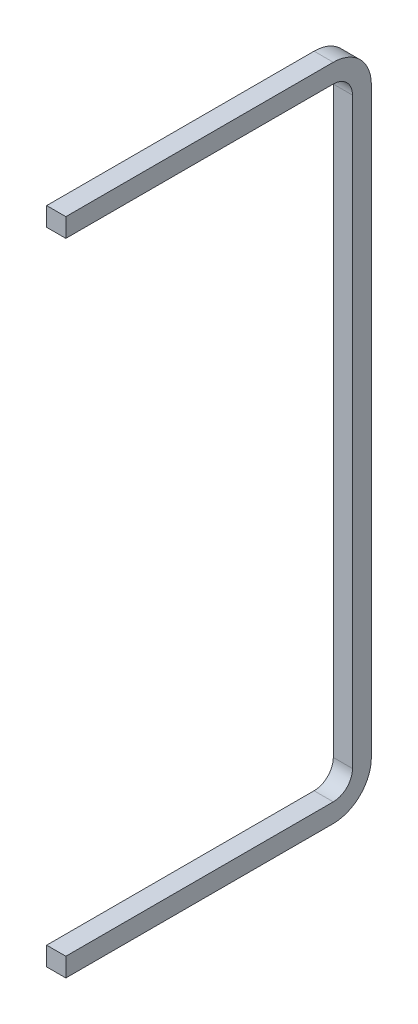
ISO-10303-21;
HEADER;
FILE_DESCRIPTION(('STEP AP214'),'2;1');
FILE_NAME('part.step','',(''),(''),'','','');
FILE_SCHEMA(('AUTOMOTIVE_DESIGN { 1 0 10303 214 1 1 1 1 }'));
ENDSEC;
DATA;
#1=APPLICATION_CONTEXT('core data for automotive mechanical design processes');
#2=APPLICATION_PROTOCOL_DEFINITION('international standard','automotive_design',2000,#1);
#3=PRODUCT_CONTEXT('',#1,'mechanical');
#4=PRODUCT('Part','Part','',(#3));
#5=PRODUCT_RELATED_PRODUCT_CATEGORY('part','',(#4));
#6=PRODUCT_DEFINITION_FORMATION('','',#4);
#7=PRODUCT_DEFINITION_CONTEXT('part definition',#1,'design');
#8=PRODUCT_DEFINITION('design','',#6,#7);
#9=PRODUCT_DEFINITION_SHAPE('','',#8);
#10=(LENGTH_UNIT() NAMED_UNIT(*) SI_UNIT(.MILLI.,.METRE.));
#11=(NAMED_UNIT(*) PLANE_ANGLE_UNIT() SI_UNIT($,.RADIAN.));
#12=(NAMED_UNIT(*) SI_UNIT($,.STERADIAN.) SOLID_ANGLE_UNIT());
#13=UNCERTAINTY_MEASURE_WITH_UNIT(LENGTH_MEASURE(1.E-05),#10,'distance_accuracy_value','');
#14=(GEOMETRIC_REPRESENTATION_CONTEXT(3) GLOBAL_UNCERTAINTY_ASSIGNED_CONTEXT((#13)) GLOBAL_UNIT_ASSIGNED_CONTEXT((#10,
#11,#12)) REPRESENTATION_CONTEXT('',''));
#15=CARTESIAN_POINT('',(0.,0.,0.));
#16=DIRECTION('',(0.,0.,1.));
#17=DIRECTION('',(1.,0.,0.));
#18=AXIS2_PLACEMENT_3D('',#15,#16,#17);
#19=CARTESIAN_POINT('',(17.,-1151.763,0.));
#20=DIRECTION('',(0.,1.,0.));
#21=DIRECTION('',(0.,0.,1.));
#22=AXIS2_PLACEMENT_3D('',#19,#20,#21);
#23=PLANE('',#22);
#24=DIRECTION('',(0.,0.,-1.));
#25=VECTOR('',#24,1.);
#26=CARTESIAN_POINT('',(-17.,-1151.763,0.));
#27=LINE('',#26,#25);
#28=CARTESIAN_POINT('',(-17.,-1151.763,0.));
#29=VERTEX_POINT('',#28);
#30=CARTESIAN_POINT('',(-17.,-1151.763,-473.9005));
#31=VERTEX_POINT('',#30);
#32=EDGE_CURVE('E141',#29,#31,#27,.T.);
#33=ORIENTED_EDGE('',*,*,#32,.T.);
#34=DIRECTION('',(-1.,0.,0.));
#35=VECTOR('',#34,1.);
#36=CARTESIAN_POINT('',(17.,-1151.763,-473.9005));
#37=LINE('',#36,#35);
#38=CARTESIAN_POINT('',(17.,-1151.763,-473.9005));
#39=VERTEX_POINT('',#38);
#40=EDGE_CURVE('E139',#39,#31,#37,.T.);
#41=ORIENTED_EDGE('',*,*,#40,.F.);
#42=DIRECTION('',(0.,0.,-1.));
#43=VECTOR('',#42,1.);
#44=CARTESIAN_POINT('',(17.,-1151.763,0.));
#45=LINE('',#44,#43);
#46=CARTESIAN_POINT('',(17.,-1151.763,0.));
#47=VERTEX_POINT('',#46);
#48=EDGE_CURVE('E129',#47,#39,#45,.T.);
#49=ORIENTED_EDGE('',*,*,#48,.F.);
#50=DIRECTION('',(-1.,0.,0.));
#51=VECTOR('',#50,1.);
#52=CARTESIAN_POINT('',(17.,-1151.763,0.));
#53=LINE('',#52,#51);
#54=EDGE_CURVE('E144',#47,#29,#53,.T.);
#55=ORIENTED_EDGE('',*,*,#54,.T.);
#56=EDGE_LOOP('',(#33,#41,#49,#55));
#57=FACE_BOUND('',#56,.T.);
#58=ADVANCED_FACE('F35',(#57),#23,.F.);
#59=CARTESIAN_POINT('',(17.,16.7005,-473.9005));
#60=DIRECTION('',(0.,-1.,0.));
#61=DIRECTION('',(0.,0.,-1.));
#62=AXIS2_PLACEMENT_3D('',#59,#60,#61);
#63=PLANE('',#62);
#64=DIRECTION('',(0.,0.,1.));
#65=VECTOR('',#64,1.);
#66=CARTESIAN_POINT('',(-17.,16.7005,-473.9005));
#67=LINE('',#66,#65);
#68=CARTESIAN_POINT('',(-17.,16.7005,-473.9005));
#69=VERTEX_POINT('',#68);
#70=CARTESIAN_POINT('',(-17.,16.7005,0.));
#71=VERTEX_POINT('',#70);
#72=EDGE_CURVE('E153',#69,#71,#67,.T.);
#73=ORIENTED_EDGE('',*,*,#72,.T.);
#74=DIRECTION('',(-1.,0.,0.));
#75=VECTOR('',#74,1.);
#76=CARTESIAN_POINT('',(17.,16.7005,0.));
#77=LINE('',#76,#75);
#78=CARTESIAN_POINT('',(17.,16.7005,0.));
#79=VERTEX_POINT('',#78);
#80=EDGE_CURVE('E44',#79,#71,#77,.T.);
#81=ORIENTED_EDGE('',*,*,#80,.F.);
#82=DIRECTION('',(0.,0.,1.));
#83=VECTOR('',#82,1.);
#84=CARTESIAN_POINT('',(17.,16.7005,-473.9005));
#85=LINE('',#84,#83);
#86=CARTESIAN_POINT('',(17.,16.7005,-473.9005));
#87=VERTEX_POINT('',#86);
#88=EDGE_CURVE('E223',#87,#79,#85,.T.);
#89=ORIENTED_EDGE('',*,*,#88,.F.);
#90=DIRECTION('',(-1.,0.,0.));
#91=VECTOR('',#90,1.);
#92=CARTESIAN_POINT('',(17.,16.7005,-473.9005));
#93=LINE('',#92,#91);
#94=EDGE_CURVE('E11',#87,#69,#93,.T.);
#95=ORIENTED_EDGE('',*,*,#94,.T.);
#96=EDGE_LOOP('',(#73,#81,#89,#95));
#97=FACE_BOUND('',#96,.T.);
#98=ADVANCED_FACE('F207',(#97),#63,.F.);
#99=CARTESIAN_POINT('',(17.,-1084.2625,-473.9005));
#100=DIRECTION('',(-1.,0.,0.));
#101=DIRECTION('',(0.,0.,1.));
#102=AXIS2_PLACEMENT_3D('',#99,#100,#101);
#103=CYLINDRICAL_SURFACE('',#102,34.0994999999999);
#104=CARTESIAN_POINT('',(-17.,-1084.2625,-473.9005));
#105=DIRECTION('',(-1.,0.,0.));
#106=DIRECTION('',(0.,0.,-1.));
#107=AXIS2_PLACEMENT_3D('',#104,#105,#106);
#108=CIRCLE('',#107,34.0994999999999);
#109=CARTESIAN_POINT('',(-17.,-1084.2625,-508.));
#110=VERTEX_POINT('',#109);
#111=CARTESIAN_POINT('',(-17.,-1118.362,-473.9005));
#112=VERTEX_POINT('',#111);
#113=EDGE_CURVE('E168',#110,#112,#108,.T.);
#114=ORIENTED_EDGE('',*,*,#113,.T.);
#115=DIRECTION('',(-1.,0.,0.));
#116=VECTOR('',#115,1.);
#117=CARTESIAN_POINT('',(17.,-1118.362,-473.9005));
#118=LINE('',#117,#116);
#119=CARTESIAN_POINT('',(17.,-1118.362,-473.9005));
#120=VERTEX_POINT('',#119);
#121=EDGE_CURVE('E188',#120,#112,#118,.T.);
#122=ORIENTED_EDGE('',*,*,#121,.F.);
#123=CARTESIAN_POINT('',(17.,-1084.2625,-473.9005));
#124=DIRECTION('',(-1.,0.,0.));
#125=DIRECTION('',(0.,0.,-1.));
#126=AXIS2_PLACEMENT_3D('',#123,#124,#125);
#127=CIRCLE('',#126,34.0994999999999);
#128=CARTESIAN_POINT('',(17.,-1084.2625,-508.));
#129=VERTEX_POINT('',#128);
#130=EDGE_CURVE('E229',#129,#120,#127,.T.);
#131=ORIENTED_EDGE('',*,*,#130,.F.);
#132=DIRECTION('',(-1.,0.,0.));
#133=VECTOR('',#132,1.);
#134=CARTESIAN_POINT('',(17.,-1084.2625,-508.));
#135=LINE('',#134,#133);
#136=EDGE_CURVE('E190',#129,#110,#135,.T.);
#137=ORIENTED_EDGE('',*,*,#136,.T.);
#138=EDGE_LOOP('',(#114,#122,#131,#137));
#139=FACE_BOUND('',#138,.T.);
#140=ADVANCED_FACE('F263',(#139),#103,.F.);
#141=CARTESIAN_POINT('',(17.,-1118.362,-473.9005));
#142=DIRECTION('',(0.,-1.,0.));
#143=DIRECTION('',(0.,0.,-1.));
#144=AXIS2_PLACEMENT_3D('',#141,#142,#143);
#145=PLANE('',#144);
#146=ORIENTED_EDGE('',*,*,#121,.T.);
#147=DIRECTION('',(0.,0.,1.));
#148=VECTOR('',#147,1.);
#149=CARTESIAN_POINT('',(-17.,-1118.362,-473.9005));
#150=LINE('',#149,#148);
#151=CARTESIAN_POINT('',(-17.,-1118.362,0.));
#152=VERTEX_POINT('',#151);
#153=EDGE_CURVE('E171',#112,#152,#150,.T.);
#154=ORIENTED_EDGE('',*,*,#153,.T.);
#155=DIRECTION('',(-1.,0.,0.));
#156=VECTOR('',#155,1.);
#157=CARTESIAN_POINT('',(17.,-1118.362,0.));
#158=LINE('',#157,#156);
#159=CARTESIAN_POINT('',(17.,-1118.362,0.));
#160=VERTEX_POINT('',#159);
#161=EDGE_CURVE('E186',#160,#152,#158,.T.);
#162=ORIENTED_EDGE('',*,*,#161,.F.);
#163=DIRECTION('',(0.,0.,1.));
#164=VECTOR('',#163,1.);
#165=CARTESIAN_POINT('',(17.,-1118.362,-473.9005));
#166=LINE('',#165,#164);
#167=EDGE_CURVE('E231',#120,#160,#166,.T.);
#168=ORIENTED_EDGE('',*,*,#167,.F.);
#169=EDGE_LOOP('',(#146,#154,#162,#168));
#170=FACE_BOUND('',#169,.T.);
#171=ADVANCED_FACE('F237',(#170),#145,.F.);
#172=CARTESIAN_POINT('',(17.,-16.7005,0.));
#173=DIRECTION('',(0.,1.,0.));
#174=DIRECTION('',(0.,0.,1.));
#175=AXIS2_PLACEMENT_3D('',#172,#173,#174);
#176=PLANE('',#175);
#177=DIRECTION('',(-1.,0.,0.));
#178=VECTOR('',#177,1.);
#179=CARTESIAN_POINT('',(17.,-16.7005,0.));
#180=LINE('',#179,#178);
#181=CARTESIAN_POINT('',(17.,-16.7005,0.));
#182=VERTEX_POINT('',#181);
#183=CARTESIAN_POINT('',(-17.,-16.7005,0.));
#184=VERTEX_POINT('',#183);
#185=EDGE_CURVE('E196',#182,#184,#180,.T.);
#186=ORIENTED_EDGE('',*,*,#185,.T.);
#187=DIRECTION('',(0.,0.,-1.));
#188=VECTOR('',#187,1.);
#189=CARTESIAN_POINT('',(-17.,-16.7005,0.));
#190=LINE('',#189,#188);
#191=CARTESIAN_POINT('',(-17.,-16.7005,-473.9005));
#192=VERTEX_POINT('',#191);
#193=EDGE_CURVE('E159',#184,#192,#190,.T.);
#194=ORIENTED_EDGE('',*,*,#193,.T.);
#195=DIRECTION('',(-1.,0.,0.));
#196=VECTOR('',#195,1.);
#197=CARTESIAN_POINT('',(17.,-16.7005,-473.9005));
#198=LINE('',#197,#196);
#199=CARTESIAN_POINT('',(17.,-16.7005,-473.9005));
#200=VERTEX_POINT('',#199);
#201=EDGE_CURVE('E194',#200,#192,#198,.T.);
#202=ORIENTED_EDGE('',*,*,#201,.F.);
#203=DIRECTION('',(0.,0.,-1.));
#204=VECTOR('',#203,1.);
#205=CARTESIAN_POINT('',(17.,-16.7005,0.));
#206=LINE('',#205,#204);
#207=EDGE_CURVE('E217',#182,#200,#206,.T.);
#208=ORIENTED_EDGE('',*,*,#207,.F.);
#209=EDGE_LOOP('',(#186,#194,#202,#208));
#210=FACE_BOUND('',#209,.T.);
#211=ADVANCED_FACE('F214',(#210),#176,.F.);
#212=CARTESIAN_POINT('',(17.,-50.8,-473.9005));
#213=DIRECTION('',(-1.,0.,0.));
#214=DIRECTION('',(0.,0.,1.));
#215=AXIS2_PLACEMENT_3D('',#212,#213,#214);
#216=CYLINDRICAL_SURFACE('',#215,34.0995);
#217=CARTESIAN_POINT('',(-17.,-50.8,-473.9005));
#218=DIRECTION('',(-1.,0.,0.));
#219=DIRECTION('',(0.,0.,-1.));
#220=AXIS2_PLACEMENT_3D('',#217,#218,#219);
#221=CIRCLE('',#220,34.0995);
#222=CARTESIAN_POINT('',(-17.,-50.8,-508.));
#223=VERTEX_POINT('',#222);
#224=EDGE_CURVE('E162',#192,#223,#221,.T.);
#225=ORIENTED_EDGE('',*,*,#224,.T.);
#226=DIRECTION('',(-1.,0.,0.));
#227=VECTOR('',#226,1.);
#228=CARTESIAN_POINT('',(17.,-50.8,-508.));
#229=LINE('',#228,#227);
#230=CARTESIAN_POINT('',(17.,-50.8,-508.));
#231=VERTEX_POINT('',#230);
#232=EDGE_CURVE('E192',#231,#223,#229,.T.);
#233=ORIENTED_EDGE('',*,*,#232,.F.);
#234=CARTESIAN_POINT('',(17.,-50.8,-473.9005));
#235=DIRECTION('',(-1.,0.,0.));
#236=DIRECTION('',(0.,0.,-1.));
#237=AXIS2_PLACEMENT_3D('',#234,#235,#236);
#238=CIRCLE('',#237,34.0995);
#239=EDGE_CURVE('E219',#200,#231,#238,.T.);
#240=ORIENTED_EDGE('',*,*,#239,.F.);
#241=ORIENTED_EDGE('',*,*,#201,.T.);
#242=EDGE_LOOP('',(#225,#233,#240,#241));
#243=FACE_BOUND('',#242,.T.);
#244=ADVANCED_FACE('F247',(#243),#216,.F.);
#245=CARTESIAN_POINT('',(17.,-50.8,-473.9005));
#246=DIRECTION('',(-1.,0.,0.));
#247=DIRECTION('',(0.,0.,1.));
#248=AXIS2_PLACEMENT_3D('',#245,#246,#247);
#249=CYLINDRICAL_SURFACE('',#248,67.5005);
#250=DIRECTION('',(-1.,0.,0.));
#251=VECTOR('',#250,1.);
#252=CARTESIAN_POINT('',(17.,-50.8,-541.401));
#253=LINE('',#252,#251);
#254=CARTESIAN_POINT('',(17.,-50.8,-541.401));
#255=VERTEX_POINT('',#254);
#256=CARTESIAN_POINT('',(-17.,-50.8,-541.401));
#257=VERTEX_POINT('',#256);
#258=EDGE_CURVE('E98',#255,#257,#253,.T.);
#259=ORIENTED_EDGE('',*,*,#258,.T.);
#260=CARTESIAN_POINT('',(-17.,-50.8,-473.9005));
#261=DIRECTION('',(1.,0.,0.));
#262=DIRECTION('',(0.,0.,-1.));
#263=AXIS2_PLACEMENT_3D('',#260,#261,#262);
#264=CIRCLE('',#263,67.5005);
#265=EDGE_CURVE('E151',#257,#69,#264,.T.);
#266=ORIENTED_EDGE('',*,*,#265,.T.);
#267=ORIENTED_EDGE('',*,*,#94,.F.);
#268=CARTESIAN_POINT('',(17.,-50.8,-473.9005));
#269=DIRECTION('',(1.,0.,0.));
#270=DIRECTION('',(0.,0.,-1.));
#271=AXIS2_PLACEMENT_3D('',#268,#269,#270);
#272=CIRCLE('',#271,67.5005);
#273=EDGE_CURVE('E182',#255,#87,#272,.T.);
#274=ORIENTED_EDGE('',*,*,#273,.F.);
#275=EDGE_LOOP('',(#259,#266,#267,#274));
#276=FACE_BOUND('',#275,.T.);
#277=ADVANCED_FACE('F243',(#276),#249,.T.);
#278=CARTESIAN_POINT('',(17.,-50.8,-508.));
#279=DIRECTION('',(0.,0.,-1.));
#280=DIRECTION('',(-1.,0.,0.));
#281=AXIS2_PLACEMENT_3D('',#278,#279,#280);
#282=PLANE('',#281);
#283=ORIENTED_EDGE('',*,*,#232,.T.);
#284=DIRECTION('',(0.,-1.,0.));
#285=VECTOR('',#284,1.);
#286=CARTESIAN_POINT('',(-17.,-50.8,-508.));
#287=LINE('',#286,#285);
#288=EDGE_CURVE('E165',#223,#110,#287,.T.);
#289=ORIENTED_EDGE('',*,*,#288,.T.);
#290=ORIENTED_EDGE('',*,*,#136,.F.);
#291=DIRECTION('',(0.,-1.,0.));
#292=VECTOR('',#291,1.);
#293=CARTESIAN_POINT('',(17.,-50.8,-508.));
#294=LINE('',#293,#292);
#295=EDGE_CURVE('E221',#231,#129,#294,.T.);
#296=ORIENTED_EDGE('',*,*,#295,.F.);
#297=EDGE_LOOP('',(#283,#289,#290,#296));
#298=FACE_BOUND('',#297,.T.);
#299=ADVANCED_FACE('F246',(#298),#282,.F.);
#300=CARTESIAN_POINT('',(17.,-1084.2625,-473.9005));
#301=DIRECTION('',(-1.,0.,0.));
#302=DIRECTION('',(0.,0.,1.));
#303=AXIS2_PLACEMENT_3D('',#300,#301,#302);
#304=CYLINDRICAL_SURFACE('',#303,67.5005);
#305=ORIENTED_EDGE('',*,*,#40,.T.);
#306=CARTESIAN_POINT('',(-17.,-1084.2625,-473.9005));
#307=DIRECTION('',(1.,0.,0.));
#308=DIRECTION('',(0.,0.,-1.));
#309=AXIS2_PLACEMENT_3D('',#306,#307,#308);
#310=CIRCLE('',#309,67.5005);
#311=CARTESIAN_POINT('',(-17.,-1084.2625,-541.401));
#312=VERTEX_POINT('',#311);
#313=EDGE_CURVE('E178',#31,#312,#310,.T.);
#314=ORIENTED_EDGE('',*,*,#313,.T.);
#315=DIRECTION('',(-1.,0.,0.));
#316=VECTOR('',#315,1.);
#317=CARTESIAN_POINT('',(17.,-1084.2625,-541.401));
#318=LINE('',#317,#316);
#319=CARTESIAN_POINT('',(17.,-1084.2625,-541.401));
#320=VERTEX_POINT('',#319);
#321=EDGE_CURVE('E91',#320,#312,#318,.T.);
#322=ORIENTED_EDGE('',*,*,#321,.F.);
#323=CARTESIAN_POINT('',(17.,-1084.2625,-473.9005));
#324=DIRECTION('',(1.,0.,0.));
#325=DIRECTION('',(0.,0.,-1.));
#326=AXIS2_PLACEMENT_3D('',#323,#324,#325);
#327=CIRCLE('',#326,67.5005);
#328=EDGE_CURVE('E133',#39,#320,#327,.T.);
#329=ORIENTED_EDGE('',*,*,#328,.F.);
#330=EDGE_LOOP('',(#305,#314,#322,#329));
#331=FACE_BOUND('',#330,.T.);
#332=ADVANCED_FACE('F146',(#331),#304,.T.);
#333=CARTESIAN_POINT('',(17.,-1084.2625,-541.401));
#334=DIRECTION('',(0.,0.,1.));
#335=DIRECTION('',(1.,0.,0.));
#336=AXIS2_PLACEMENT_3D('',#333,#334,#335);
#337=PLANE('',#336);
#338=DIRECTION('',(0.,1.,0.));
#339=VECTOR('',#338,1.);
#340=CARTESIAN_POINT('',(-17.,-1084.2625,-541.401));
#341=LINE('',#340,#339);
#342=EDGE_CURVE('E180',#312,#257,#341,.T.);
#343=ORIENTED_EDGE('',*,*,#342,.T.);
#344=ORIENTED_EDGE('',*,*,#258,.F.);
#345=DIRECTION('',(0.,1.,0.));
#346=VECTOR('',#345,1.);
#347=CARTESIAN_POINT('',(17.,-1084.2625,-541.401));
#348=LINE('',#347,#346);
#349=EDGE_CURVE('E52',#320,#255,#348,.T.);
#350=ORIENTED_EDGE('',*,*,#349,.F.);
#351=ORIENTED_EDGE('',*,*,#321,.T.);
#352=EDGE_LOOP('',(#343,#344,#350,#351));
#353=FACE_BOUND('',#352,.T.);
#354=ADVANCED_FACE('F242',(#353),#337,.F.);
#355=CARTESIAN_POINT('',(17.,-50.8,-473.9005));
#356=DIRECTION('',(1.,0.,0.));
#357=DIRECTION('',(0.,0.,-1.));
#358=AXIS2_PLACEMENT_3D('',#355,#356,#357);
#359=PLANE('',#358);
#360=ORIENTED_EDGE('',*,*,#273,.T.);
#361=ORIENTED_EDGE('',*,*,#88,.T.);
#362=DIRECTION('',(0.,-1.,0.));
#363=VECTOR('',#362,1.);
#364=CARTESIAN_POINT('',(17.,16.7005,0.));
#365=LINE('',#364,#363);
#366=EDGE_CURVE('E204',#79,#182,#365,.T.);
#367=ORIENTED_EDGE('',*,*,#366,.T.);
#368=ORIENTED_EDGE('',*,*,#207,.T.);
#369=ORIENTED_EDGE('',*,*,#239,.T.);
#370=ORIENTED_EDGE('',*,*,#295,.T.);
#371=ORIENTED_EDGE('',*,*,#130,.T.);
#372=ORIENTED_EDGE('',*,*,#167,.T.);
#373=DIRECTION('',(0.,-1.,0.));
#374=VECTOR('',#373,1.);
#375=CARTESIAN_POINT('',(17.,-1151.763,0.));
#376=LINE('',#375,#374);
#377=EDGE_CURVE('E135',#160,#47,#376,.T.);
#378=ORIENTED_EDGE('',*,*,#377,.T.);
#379=ORIENTED_EDGE('',*,*,#48,.T.);
#380=ORIENTED_EDGE('',*,*,#328,.T.);
#381=ORIENTED_EDGE('',*,*,#349,.T.);
#382=EDGE_LOOP('',(#360,#361,#367,#368,#369,#370,#371,#372,#378,#379,#380,#381));
#383=FACE_BOUND('',#382,.T.);
#384=ADVANCED_FACE('F131',(#383),#359,.T.);
#385=CARTESIAN_POINT('',(-17.,-50.8,-473.9005));
#386=DIRECTION('',(1.,0.,0.));
#387=DIRECTION('',(0.,0.,-1.));
#388=AXIS2_PLACEMENT_3D('',#385,#386,#387);
#389=PLANE('',#388);
#390=ORIENTED_EDGE('',*,*,#265,.F.);
#391=ORIENTED_EDGE('',*,*,#342,.F.);
#392=ORIENTED_EDGE('',*,*,#313,.F.);
#393=ORIENTED_EDGE('',*,*,#32,.F.);
#394=DIRECTION('',(0.,-1.,0.));
#395=VECTOR('',#394,1.);
#396=CARTESIAN_POINT('',(-17.,-1151.763,0.));
#397=LINE('',#396,#395);
#398=EDGE_CURVE('E174',#152,#29,#397,.T.);
#399=ORIENTED_EDGE('',*,*,#398,.F.);
#400=ORIENTED_EDGE('',*,*,#153,.F.);
#401=ORIENTED_EDGE('',*,*,#113,.F.);
#402=ORIENTED_EDGE('',*,*,#288,.F.);
#403=ORIENTED_EDGE('',*,*,#224,.F.);
#404=ORIENTED_EDGE('',*,*,#193,.F.);
#405=DIRECTION('',(0.,-1.,0.));
#406=VECTOR('',#405,1.);
#407=CARTESIAN_POINT('',(-17.,16.7005,0.));
#408=LINE('',#407,#406);
#409=EDGE_CURVE('E156',#71,#184,#408,.T.);
#410=ORIENTED_EDGE('',*,*,#409,.F.);
#411=ORIENTED_EDGE('',*,*,#72,.F.);
#412=EDGE_LOOP('',(#390,#391,#392,#393,#399,#400,#401,#402,#403,#404,#410,#411));
#413=FACE_BOUND('',#412,.T.);
#414=ADVANCED_FACE('F210',(#413),#389,.F.);
#415=CARTESIAN_POINT('',(0.,0.,0.));
#416=DIRECTION('',(0.,0.,1.));
#417=DIRECTION('',(1.,0.,0.));
#418=AXIS2_PLACEMENT_3D('',#415,#416,#417);
#419=PLANE('',#418);
#420=ORIENTED_EDGE('',*,*,#409,.T.);
#421=ORIENTED_EDGE('',*,*,#185,.F.);
#422=ORIENTED_EDGE('',*,*,#366,.F.);
#423=ORIENTED_EDGE('',*,*,#80,.T.);
#424=EDGE_LOOP('',(#420,#421,#422,#423));
#425=FACE_BOUND('',#424,.T.);
#426=ADVANCED_FACE('F200',(#425),#419,.T.);
#427=CARTESIAN_POINT('',(0.,-1135.0625,0.));
#428=DIRECTION('',(0.,0.,-1.));
#429=DIRECTION('',(-1.,0.,0.));
#430=AXIS2_PLACEMENT_3D('',#427,#428,#429);
#431=PLANE('',#430);
#432=ORIENTED_EDGE('',*,*,#54,.F.);
#433=ORIENTED_EDGE('',*,*,#377,.F.);
#434=ORIENTED_EDGE('',*,*,#161,.T.);
#435=ORIENTED_EDGE('',*,*,#398,.T.);
#436=EDGE_LOOP('',(#432,#433,#434,#435));
#437=FACE_BOUND('',#436,.T.);
#438=ADVANCED_FACE('F37',(#437),#431,.F.);
#439=CLOSED_SHELL('',(#58,#98,#140,#171,#211,#244,#277,#299,#332,#354,#384,#414,#426,#438));
#440=MANIFOLD_SOLID_BREP('B2',#439);
#441=ADVANCED_BREP_SHAPE_REPRESENTATION('',(#18,#440),#14);
#442=SHAPE_DEFINITION_REPRESENTATION(#9,#441);
ENDSEC;
END-ISO-10303-21;
